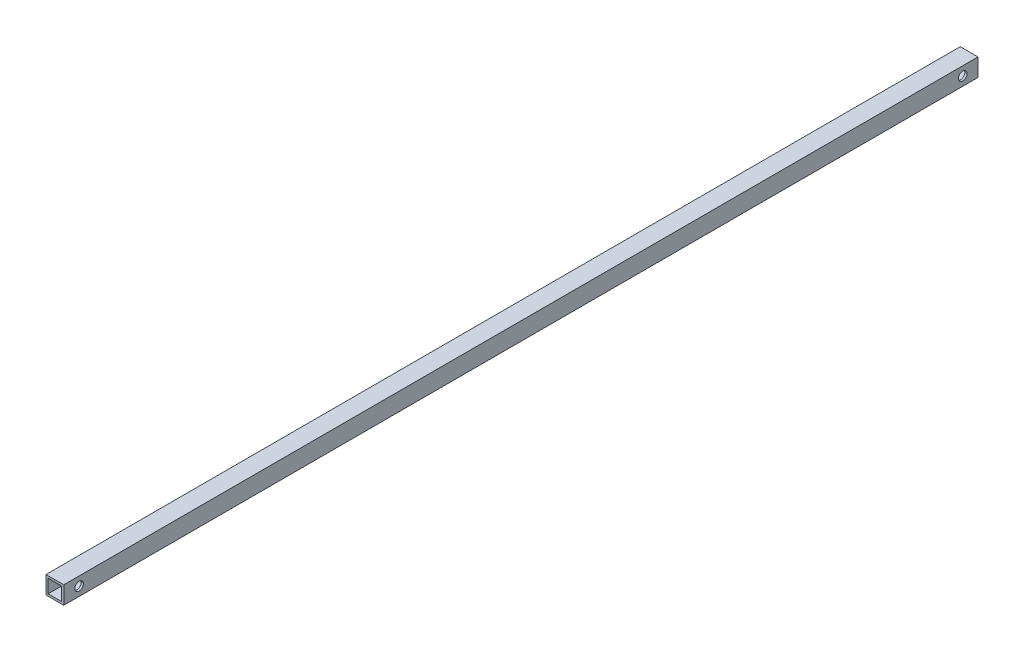
ISO-10303-21;
HEADER;
FILE_DESCRIPTION(('STEP AP214'),'2;1');
FILE_NAME('part.step','',(''),(''),'','','');
FILE_SCHEMA(('AUTOMOTIVE_DESIGN { 1 0 10303 214 1 1 1 1 }'));
ENDSEC;
DATA;
#1=APPLICATION_CONTEXT('core data for automotive mechanical design processes');
#2=APPLICATION_PROTOCOL_DEFINITION('international standard','automotive_design',2000,#1);
#3=PRODUCT_CONTEXT('',#1,'mechanical');
#4=PRODUCT('Part','Part','',(#3));
#5=PRODUCT_RELATED_PRODUCT_CATEGORY('part','',(#4));
#6=PRODUCT_DEFINITION_FORMATION('','',#4);
#7=PRODUCT_DEFINITION_CONTEXT('part definition',#1,'design');
#8=PRODUCT_DEFINITION('design','',#6,#7);
#9=PRODUCT_DEFINITION_SHAPE('','',#8);
#10=(LENGTH_UNIT() NAMED_UNIT(*) SI_UNIT(.MILLI.,.METRE.));
#11=(NAMED_UNIT(*) PLANE_ANGLE_UNIT() SI_UNIT($,.RADIAN.));
#12=(NAMED_UNIT(*) SI_UNIT($,.STERADIAN.) SOLID_ANGLE_UNIT());
#13=UNCERTAINTY_MEASURE_WITH_UNIT(LENGTH_MEASURE(1.E-05),#10,'distance_accuracy_value','');
#14=(GEOMETRIC_REPRESENTATION_CONTEXT(3) GLOBAL_UNCERTAINTY_ASSIGNED_CONTEXT((#13)) GLOBAL_UNIT_ASSIGNED_CONTEXT((#10,
#11,#12)) REPRESENTATION_CONTEXT('',''));
#15=CARTESIAN_POINT('',(0.,0.,0.));
#16=DIRECTION('',(0.,0.,1.));
#17=DIRECTION('',(1.,0.,0.));
#18=AXIS2_PLACEMENT_3D('',#15,#16,#17);
#19=CARTESIAN_POINT('',(25.,0.,1285.5));
#20=DIRECTION('',(-1.,0.,0.));
#21=DIRECTION('',(0.,-1.,0.));
#22=AXIS2_PLACEMENT_3D('',#19,#20,#21);
#23=PLANE('',#22);
#24=CARTESIAN_POINT('',(25.,-12.5,1264.));
#25=DIRECTION('',(-1.,0.,0.));
#26=DIRECTION('',(0.,-1.,0.));
#27=AXIS2_PLACEMENT_3D('',#24,#25,#26);
#28=CIRCLE('',#27,6.0000000000001);
#29=CARTESIAN_POINT('',(25.,-18.5000000000001,1264.));
#30=VERTEX_POINT('',#29);
#31=EDGE_CURVE('E244',#30,#30,#28,.T.);
#32=ORIENTED_EDGE('',*,*,#31,.T.);
#33=EDGE_LOOP('',(#32));
#34=FACE_BOUND('',#33,.T.);
#35=DIRECTION('',(0.,1.,0.));
#36=VECTOR('',#35,1.);
#37=CARTESIAN_POINT('',(25.,0.,0.));
#38=LINE('',#37,#36);
#39=CARTESIAN_POINT('',(25.,-25.,0.));
#40=VERTEX_POINT('',#39);
#41=CARTESIAN_POINT('',(25.,0.,0.));
#42=VERTEX_POINT('',#41);
#43=EDGE_CURVE('E151',#40,#42,#38,.T.);
#44=ORIENTED_EDGE('',*,*,#43,.T.);
#45=DIRECTION('',(0.,0.,-1.));
#46=VECTOR('',#45,1.);
#47=CARTESIAN_POINT('',(25.,0.,1285.5));
#48=LINE('',#47,#46);
#49=CARTESIAN_POINT('',(25.,0.,1285.5));
#50=VERTEX_POINT('',#49);
#51=EDGE_CURVE('E156',#50,#42,#48,.T.);
#52=ORIENTED_EDGE('',*,*,#51,.F.);
#53=DIRECTION('',(0.,1.,0.));
#54=VECTOR('',#53,1.);
#55=CARTESIAN_POINT('',(25.,0.,1285.5));
#56=LINE('',#55,#54);
#57=CARTESIAN_POINT('',(25.,-25.,1285.5));
#58=VERTEX_POINT('',#57);
#59=EDGE_CURVE('E142',#58,#50,#56,.T.);
#60=ORIENTED_EDGE('',*,*,#59,.F.);
#61=DIRECTION('',(0.,0.,-1.));
#62=VECTOR('',#61,1.);
#63=CARTESIAN_POINT('',(25.,-25.,1285.5));
#64=LINE('',#63,#62);
#65=EDGE_CURVE('E40',#58,#40,#64,.T.);
#66=ORIENTED_EDGE('',*,*,#65,.T.);
#67=EDGE_LOOP('',(#44,#52,#60,#66));
#68=FACE_BOUND('',#67,.T.);
#69=CARTESIAN_POINT('',(25.,-12.5,21.4999999999999));
#70=DIRECTION('',(-1.,0.,0.));
#71=DIRECTION('',(0.,-1.,0.));
#72=AXIS2_PLACEMENT_3D('',#69,#70,#71);
#73=CIRCLE('',#72,6.0000000000001);
#74=CARTESIAN_POINT('',(25.,-18.5000000000001,21.4999999999999));
#75=VERTEX_POINT('',#74);
#76=EDGE_CURVE('E230',#75,#75,#73,.T.);
#77=ORIENTED_EDGE('',*,*,#76,.T.);
#78=EDGE_LOOP('',(#77));
#79=FACE_BOUND('',#78,.T.);
#80=ADVANCED_FACE('F32',(#34,#68,#79),#23,.F.);
#81=CARTESIAN_POINT('',(22.,-3.,1285.5));
#82=DIRECTION('',(-1.,0.,0.));
#83=DIRECTION('',(0.,-1.,0.));
#84=AXIS2_PLACEMENT_3D('',#81,#82,#83);
#85=PLANE('',#84);
#86=CARTESIAN_POINT('',(22.,-12.5,1264.));
#87=DIRECTION('',(-1.,0.,0.));
#88=DIRECTION('',(0.,-1.,0.));
#89=AXIS2_PLACEMENT_3D('',#86,#87,#88);
#90=CIRCLE('',#89,6.0000000000001);
#91=CARTESIAN_POINT('',(22.,-18.5000000000001,1264.));
#92=VERTEX_POINT('',#91);
#93=EDGE_CURVE('E246',#92,#92,#90,.T.);
#94=ORIENTED_EDGE('',*,*,#93,.F.);
#95=EDGE_LOOP('',(#94));
#96=FACE_BOUND('',#95,.T.);
#97=DIRECTION('',(0.,1.,0.));
#98=VECTOR('',#97,1.);
#99=CARTESIAN_POINT('',(22.,-3.,0.));
#100=LINE('',#99,#98);
#101=CARTESIAN_POINT('',(22.,-22.,0.));
#102=VERTEX_POINT('',#101);
#103=CARTESIAN_POINT('',(22.,-3.,0.));
#104=VERTEX_POINT('',#103);
#105=EDGE_CURVE('E128',#102,#104,#100,.T.);
#106=ORIENTED_EDGE('',*,*,#105,.F.);
#107=DIRECTION('',(0.,0.,-1.));
#108=VECTOR('',#107,1.);
#109=CARTESIAN_POINT('',(22.,-22.,1285.5));
#110=LINE('',#109,#108);
#111=CARTESIAN_POINT('',(22.,-22.,1285.5));
#112=VERTEX_POINT('',#111);
#113=EDGE_CURVE('E114',#112,#102,#110,.T.);
#114=ORIENTED_EDGE('',*,*,#113,.F.);
#115=DIRECTION('',(0.,1.,0.));
#116=VECTOR('',#115,1.);
#117=CARTESIAN_POINT('',(22.,-3.,1285.5));
#118=LINE('',#117,#116);
#119=CARTESIAN_POINT('',(22.,-3.,1285.5));
#120=VERTEX_POINT('',#119);
#121=EDGE_CURVE('E118',#112,#120,#118,.T.);
#122=ORIENTED_EDGE('',*,*,#121,.T.);
#123=DIRECTION('',(0.,0.,-1.));
#124=VECTOR('',#123,1.);
#125=CARTESIAN_POINT('',(22.,-3.,1285.5));
#126=LINE('',#125,#124);
#127=EDGE_CURVE('E47',#120,#104,#126,.T.);
#128=ORIENTED_EDGE('',*,*,#127,.T.);
#129=EDGE_LOOP('',(#106,#114,#122,#128));
#130=FACE_BOUND('',#129,.T.);
#131=CARTESIAN_POINT('',(22.,-12.5,21.4999999999999));
#132=DIRECTION('',(-1.,0.,0.));
#133=DIRECTION('',(0.,-1.,0.));
#134=AXIS2_PLACEMENT_3D('',#131,#132,#133);
#135=CIRCLE('',#134,6.0000000000001);
#136=CARTESIAN_POINT('',(22.,-18.5000000000001,21.4999999999999));
#137=VERTEX_POINT('',#136);
#138=EDGE_CURVE('E233',#137,#137,#135,.T.);
#139=ORIENTED_EDGE('',*,*,#138,.F.);
#140=EDGE_LOOP('',(#139));
#141=FACE_BOUND('',#140,.T.);
#142=ADVANCED_FACE('F189',(#96,#130,#141),#85,.T.);
#143=CARTESIAN_POINT('',(0.,-25.,1285.5));
#144=DIRECTION('',(0.,0.,1.));
#145=DIRECTION('',(1.,0.,0.));
#146=AXIS2_PLACEMENT_3D('',#143,#144,#145);
#147=PLANE('',#146);
#148=DIRECTION('',(0.,-1.,0.));
#149=VECTOR('',#148,1.);
#150=CARTESIAN_POINT('',(0.,0.,1285.5));
#151=LINE('',#150,#149);
#152=CARTESIAN_POINT('',(0.,0.,1285.5));
#153=VERTEX_POINT('',#152);
#154=CARTESIAN_POINT('',(0.,-25.,1285.5));
#155=VERTEX_POINT('',#154);
#156=EDGE_CURVE('E136',#153,#155,#151,.T.);
#157=ORIENTED_EDGE('',*,*,#156,.T.);
#158=DIRECTION('',(1.,0.,0.));
#159=VECTOR('',#158,1.);
#160=CARTESIAN_POINT('',(0.,-25.,1285.5));
#161=LINE('',#160,#159);
#162=EDGE_CURVE('E139',#155,#58,#161,.T.);
#163=ORIENTED_EDGE('',*,*,#162,.T.);
#164=ORIENTED_EDGE('',*,*,#59,.T.);
#165=DIRECTION('',(-1.,0.,0.));
#166=VECTOR('',#165,1.);
#167=CARTESIAN_POINT('',(0.,0.,1285.5));
#168=LINE('',#167,#166);
#169=EDGE_CURVE('E144',#50,#153,#168,.T.);
#170=ORIENTED_EDGE('',*,*,#169,.T.);
#171=EDGE_LOOP('',(#157,#163,#164,#170));
#172=FACE_BOUND('',#171,.T.);
#173=DIRECTION('',(1.,0.,0.));
#174=VECTOR('',#173,1.);
#175=CARTESIAN_POINT('',(3.,-22.,1285.5));
#176=LINE('',#175,#174);
#177=CARTESIAN_POINT('',(3.,-22.,1285.5));
#178=VERTEX_POINT('',#177);
#179=EDGE_CURVE('E105',#178,#112,#176,.T.);
#180=ORIENTED_EDGE('',*,*,#179,.F.);
#181=DIRECTION('',(0.,-1.,0.));
#182=VECTOR('',#181,1.);
#183=CARTESIAN_POINT('',(3.,-3.,1285.5));
#184=LINE('',#183,#182);
#185=CARTESIAN_POINT('',(3.,-3.,1285.5));
#186=VERTEX_POINT('',#185);
#187=EDGE_CURVE('E97',#186,#178,#184,.T.);
#188=ORIENTED_EDGE('',*,*,#187,.F.);
#189=DIRECTION('',(-1.,0.,0.));
#190=VECTOR('',#189,1.);
#191=CARTESIAN_POINT('',(3.,-3.,1285.5));
#192=LINE('',#191,#190);
#193=EDGE_CURVE('E120',#120,#186,#192,.T.);
#194=ORIENTED_EDGE('',*,*,#193,.F.);
#195=ORIENTED_EDGE('',*,*,#121,.F.);
#196=EDGE_LOOP('',(#180,#188,#194,#195));
#197=FACE_BOUND('',#196,.T.);
#198=ADVANCED_FACE('F117',(#172,#197),#147,.T.);
#199=CARTESIAN_POINT('',(0.,-25.,0.));
#200=DIRECTION('',(0.,0.,1.));
#201=DIRECTION('',(1.,0.,0.));
#202=AXIS2_PLACEMENT_3D('',#199,#200,#201);
#203=PLANE('',#202);
#204=DIRECTION('',(0.,-1.,0.));
#205=VECTOR('',#204,1.);
#206=CARTESIAN_POINT('',(0.,0.,0.));
#207=LINE('',#206,#205);
#208=CARTESIAN_POINT('',(0.,0.,0.));
#209=VERTEX_POINT('',#208);
#210=CARTESIAN_POINT('',(0.,-25.,0.));
#211=VERTEX_POINT('',#210);
#212=EDGE_CURVE('E113',#209,#211,#207,.T.);
#213=ORIENTED_EDGE('',*,*,#212,.F.);
#214=DIRECTION('',(-1.,0.,0.));
#215=VECTOR('',#214,1.);
#216=CARTESIAN_POINT('',(0.,0.,0.));
#217=LINE('',#216,#215);
#218=EDGE_CURVE('E140',#42,#209,#217,.T.);
#219=ORIENTED_EDGE('',*,*,#218,.F.);
#220=ORIENTED_EDGE('',*,*,#43,.F.);
#221=DIRECTION('',(1.,0.,0.));
#222=VECTOR('',#221,1.);
#223=CARTESIAN_POINT('',(0.,-25.,0.));
#224=LINE('',#223,#222);
#225=EDGE_CURVE('E149',#211,#40,#224,.T.);
#226=ORIENTED_EDGE('',*,*,#225,.F.);
#227=EDGE_LOOP('',(#213,#219,#220,#226));
#228=FACE_BOUND('',#227,.T.);
#229=DIRECTION('',(0.,-1.,0.));
#230=VECTOR('',#229,1.);
#231=CARTESIAN_POINT('',(3.,-3.,0.));
#232=LINE('',#231,#230);
#233=CARTESIAN_POINT('',(3.,-3.,0.));
#234=VERTEX_POINT('',#233);
#235=CARTESIAN_POINT('',(3.,-22.,0.));
#236=VERTEX_POINT('',#235);
#237=EDGE_CURVE('E55',#234,#236,#232,.T.);
#238=ORIENTED_EDGE('',*,*,#237,.T.);
#239=DIRECTION('',(1.,0.,0.));
#240=VECTOR('',#239,1.);
#241=CARTESIAN_POINT('',(3.,-22.,0.));
#242=LINE('',#241,#240);
#243=EDGE_CURVE('E112',#236,#102,#242,.T.);
#244=ORIENTED_EDGE('',*,*,#243,.T.);
#245=ORIENTED_EDGE('',*,*,#105,.T.);
#246=DIRECTION('',(-1.,0.,0.));
#247=VECTOR('',#246,1.);
#248=CARTESIAN_POINT('',(3.,-3.,0.));
#249=LINE('',#248,#247);
#250=EDGE_CURVE('E106',#104,#234,#249,.T.);
#251=ORIENTED_EDGE('',*,*,#250,.T.);
#252=EDGE_LOOP('',(#238,#244,#245,#251));
#253=FACE_BOUND('',#252,.T.);
#254=ADVANCED_FACE('F169',(#228,#253),#203,.F.);
#255=CARTESIAN_POINT('',(0.,0.,1285.5));
#256=DIRECTION('',(1.,0.,0.));
#257=DIRECTION('',(0.,1.,0.));
#258=AXIS2_PLACEMENT_3D('',#255,#256,#257);
#259=PLANE('',#258);
#260=CARTESIAN_POINT('',(0.,-12.5,21.4999999999999));
#261=DIRECTION('',(-1.,0.,0.));
#262=DIRECTION('',(0.,0.,1.));
#263=AXIS2_PLACEMENT_3D('',#260,#261,#262);
#264=CIRCLE('',#263,3.);
#265=CARTESIAN_POINT('',(0.,-12.5,24.4999999999998));
#266=VERTEX_POINT('',#265);
#267=EDGE_CURVE('E238',#266,#266,#264,.T.);
#268=ORIENTED_EDGE('',*,*,#267,.F.);
#269=EDGE_LOOP('',(#268));
#270=FACE_BOUND('',#269,.T.);
#271=CARTESIAN_POINT('',(0.,-12.5,1264.));
#272=DIRECTION('',(-1.,0.,0.));
#273=DIRECTION('',(0.,0.,1.));
#274=AXIS2_PLACEMENT_3D('',#271,#272,#273);
#275=CIRCLE('',#274,3.);
#276=CARTESIAN_POINT('',(0.,-12.5,1267.));
#277=VERTEX_POINT('',#276);
#278=EDGE_CURVE('E249',#277,#277,#275,.T.);
#279=ORIENTED_EDGE('',*,*,#278,.F.);
#280=EDGE_LOOP('',(#279));
#281=FACE_BOUND('',#280,.T.);
#282=ORIENTED_EDGE('',*,*,#212,.T.);
#283=DIRECTION('',(0.,0.,-1.));
#284=VECTOR('',#283,1.);
#285=CARTESIAN_POINT('',(0.,-25.,1285.5));
#286=LINE('',#285,#284);
#287=EDGE_CURVE('E11',#155,#211,#286,.T.);
#288=ORIENTED_EDGE('',*,*,#287,.F.);
#289=ORIENTED_EDGE('',*,*,#156,.F.);
#290=DIRECTION('',(0.,0.,-1.));
#291=VECTOR('',#290,1.);
#292=CARTESIAN_POINT('',(0.,0.,1285.5));
#293=LINE('',#292,#291);
#294=EDGE_CURVE('E146',#153,#209,#293,.T.);
#295=ORIENTED_EDGE('',*,*,#294,.T.);
#296=EDGE_LOOP('',(#282,#288,#289,#295));
#297=FACE_BOUND('',#296,.T.);
#298=ADVANCED_FACE('F34',(#270,#281,#297),#259,.F.);
#299=CARTESIAN_POINT('',(0.,-25.,1285.5));
#300=DIRECTION('',(0.,1.,0.));
#301=DIRECTION('',(0.,0.,1.));
#302=AXIS2_PLACEMENT_3D('',#299,#300,#301);
#303=PLANE('',#302);
#304=ORIENTED_EDGE('',*,*,#225,.T.);
#305=ORIENTED_EDGE('',*,*,#65,.F.);
#306=ORIENTED_EDGE('',*,*,#162,.F.);
#307=ORIENTED_EDGE('',*,*,#287,.T.);
#308=EDGE_LOOP('',(#304,#305,#306,#307));
#309=FACE_BOUND('',#308,.T.);
#310=ADVANCED_FACE('F179',(#309),#303,.F.);
#311=CARTESIAN_POINT('',(0.,0.,1285.5));
#312=DIRECTION('',(0.,-1.,0.));
#313=DIRECTION('',(0.,0.,-1.));
#314=AXIS2_PLACEMENT_3D('',#311,#312,#313);
#315=PLANE('',#314);
#316=ORIENTED_EDGE('',*,*,#218,.T.);
#317=ORIENTED_EDGE('',*,*,#294,.F.);
#318=ORIENTED_EDGE('',*,*,#169,.F.);
#319=ORIENTED_EDGE('',*,*,#51,.T.);
#320=EDGE_LOOP('',(#316,#317,#318,#319));
#321=FACE_BOUND('',#320,.T.);
#322=ADVANCED_FACE('F173',(#321),#315,.F.);
#323=CARTESIAN_POINT('',(3.,-3.,1285.5));
#324=DIRECTION('',(1.,0.,0.));
#325=DIRECTION('',(0.,1.,0.));
#326=AXIS2_PLACEMENT_3D('',#323,#324,#325);
#327=PLANE('',#326);
#328=CARTESIAN_POINT('',(3.,-12.5,21.4999999999999));
#329=DIRECTION('',(1.,0.,0.));
#330=DIRECTION('',(0.,1.,0.));
#331=AXIS2_PLACEMENT_3D('',#328,#329,#330);
#332=CIRCLE('',#331,2.99999999999999);
#333=CARTESIAN_POINT('',(3.,-9.50000000000001,21.4999999999999));
#334=VERTEX_POINT('',#333);
#335=EDGE_CURVE('E235',#334,#334,#332,.T.);
#336=ORIENTED_EDGE('',*,*,#335,.F.);
#337=EDGE_LOOP('',(#336));
#338=FACE_BOUND('',#337,.T.);
#339=CARTESIAN_POINT('',(3.,-12.5,1264.));
#340=DIRECTION('',(1.,0.,0.));
#341=DIRECTION('',(0.,1.,0.));
#342=AXIS2_PLACEMENT_3D('',#339,#340,#341);
#343=CIRCLE('',#342,2.99999999999999);
#344=CARTESIAN_POINT('',(3.,-9.50000000000001,1264.));
#345=VERTEX_POINT('',#344);
#346=EDGE_CURVE('E126',#345,#345,#343,.T.);
#347=ORIENTED_EDGE('',*,*,#346,.F.);
#348=EDGE_LOOP('',(#347));
#349=FACE_BOUND('',#348,.T.);
#350=ORIENTED_EDGE('',*,*,#237,.F.);
#351=DIRECTION('',(0.,0.,-1.));
#352=VECTOR('',#351,1.);
#353=CARTESIAN_POINT('',(3.,-3.,1285.5));
#354=LINE('',#353,#352);
#355=EDGE_CURVE('E101',#186,#234,#354,.T.);
#356=ORIENTED_EDGE('',*,*,#355,.F.);
#357=ORIENTED_EDGE('',*,*,#187,.T.);
#358=DIRECTION('',(0.,0.,-1.));
#359=VECTOR('',#358,1.);
#360=CARTESIAN_POINT('',(3.,-22.,1285.5));
#361=LINE('',#360,#359);
#362=EDGE_CURVE('E100',#178,#236,#361,.T.);
#363=ORIENTED_EDGE('',*,*,#362,.T.);
#364=EDGE_LOOP('',(#350,#356,#357,#363));
#365=FACE_BOUND('',#364,.T.);
#366=ADVANCED_FACE('F99',(#338,#349,#365),#327,.T.);
#367=CARTESIAN_POINT('',(3.,-22.,1285.5));
#368=DIRECTION('',(0.,1.,0.));
#369=DIRECTION('',(0.,0.,1.));
#370=AXIS2_PLACEMENT_3D('',#367,#368,#369);
#371=PLANE('',#370);
#372=ORIENTED_EDGE('',*,*,#243,.F.);
#373=ORIENTED_EDGE('',*,*,#362,.F.);
#374=ORIENTED_EDGE('',*,*,#179,.T.);
#375=ORIENTED_EDGE('',*,*,#113,.T.);
#376=EDGE_LOOP('',(#372,#373,#374,#375));
#377=FACE_BOUND('',#376,.T.);
#378=ADVANCED_FACE('F109',(#377),#371,.T.);
#379=CARTESIAN_POINT('',(3.,-3.,1285.5));
#380=DIRECTION('',(0.,-1.,0.));
#381=DIRECTION('',(0.,0.,-1.));
#382=AXIS2_PLACEMENT_3D('',#379,#380,#381);
#383=PLANE('',#382);
#384=ORIENTED_EDGE('',*,*,#250,.F.);
#385=ORIENTED_EDGE('',*,*,#127,.F.);
#386=ORIENTED_EDGE('',*,*,#193,.T.);
#387=ORIENTED_EDGE('',*,*,#355,.T.);
#388=EDGE_LOOP('',(#384,#385,#386,#387));
#389=FACE_BOUND('',#388,.T.);
#390=ADVANCED_FACE('F206',(#389),#383,.T.);
#391=CARTESIAN_POINT('',(0.,-12.5,1264.));
#392=DIRECTION('',(-1.,0.,0.));
#393=DIRECTION('',(0.,0.,1.));
#394=AXIS2_PLACEMENT_3D('',#391,#392,#393);
#395=CYLINDRICAL_SURFACE('',#394,2.99999999999999);
#396=ORIENTED_EDGE('',*,*,#346,.T.);
#397=EDGE_LOOP('',(#396));
#398=FACE_BOUND('',#397,.T.);
#399=ORIENTED_EDGE('',*,*,#278,.T.);
#400=EDGE_LOOP('',(#399));
#401=FACE_BOUND('',#400,.T.);
#402=ADVANCED_FACE('F210',(#398,#401),#395,.F.);
#403=CARTESIAN_POINT('',(5.02943725152272,-12.5,1264.));
#404=DIRECTION('',(1.,0.,0.));
#405=DIRECTION('',(0.,1.,0.));
#406=AXIS2_PLACEMENT_3D('',#403,#404,#405);
#407=CYLINDRICAL_SURFACE('',#406,6.0000000000001);
#408=ORIENTED_EDGE('',*,*,#31,.F.);
#409=EDGE_LOOP('',(#408));
#410=FACE_BOUND('',#409,.T.);
#411=ORIENTED_EDGE('',*,*,#93,.T.);
#412=EDGE_LOOP('',(#411));
#413=FACE_BOUND('',#412,.T.);
#414=ADVANCED_FACE('F213',(#410,#413),#407,.F.);
#415=CARTESIAN_POINT('',(0.,-12.5,21.4999999999999));
#416=DIRECTION('',(-1.,0.,0.));
#417=DIRECTION('',(0.,0.,1.));
#418=AXIS2_PLACEMENT_3D('',#415,#416,#417);
#419=CYLINDRICAL_SURFACE('',#418,2.99999999999999);
#420=ORIENTED_EDGE('',*,*,#335,.T.);
#421=EDGE_LOOP('',(#420));
#422=FACE_BOUND('',#421,.T.);
#423=ORIENTED_EDGE('',*,*,#267,.T.);
#424=EDGE_LOOP('',(#423));
#425=FACE_BOUND('',#424,.T.);
#426=ADVANCED_FACE('F217',(#422,#425),#419,.F.);
#427=CARTESIAN_POINT('',(5.0294372515226,-12.5,21.4999999999999));
#428=DIRECTION('',(1.,0.,0.));
#429=DIRECTION('',(0.,1.,0.));
#430=AXIS2_PLACEMENT_3D('',#427,#428,#429);
#431=CYLINDRICAL_SURFACE('',#430,6.0000000000001);
#432=ORIENTED_EDGE('',*,*,#76,.F.);
#433=EDGE_LOOP('',(#432));
#434=FACE_BOUND('',#433,.T.);
#435=ORIENTED_EDGE('',*,*,#138,.T.);
#436=EDGE_LOOP('',(#435));
#437=FACE_BOUND('',#436,.T.);
#438=ADVANCED_FACE('F221',(#434,#437),#431,.F.);
#439=CLOSED_SHELL('',(#80,#142,#198,#254,#298,#310,#322,#366,#378,#390,#402,#414,#426,#438));
#440=MANIFOLD_SOLID_BREP('B2',#439);
#441=ADVANCED_BREP_SHAPE_REPRESENTATION('',(#18,#440),#14);
#442=SHAPE_DEFINITION_REPRESENTATION(#9,#441);
ENDSEC;
END-ISO-10303-21;
